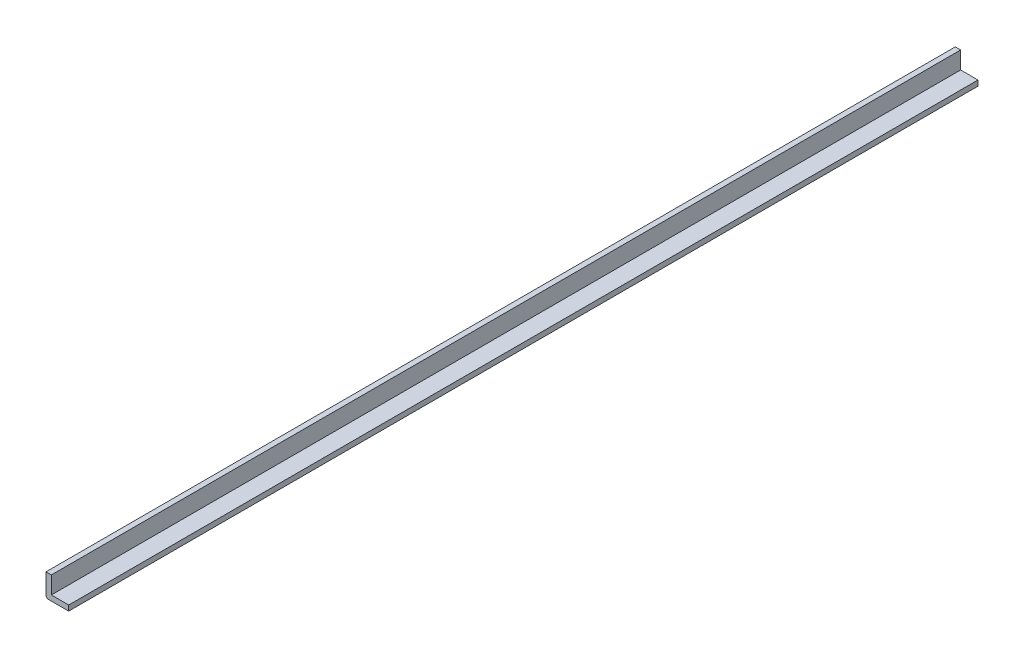
ISO-10303-21;
HEADER;
FILE_DESCRIPTION(('STEP AP214'),'2;1');
FILE_NAME('part.step','',(''),(''),'','','');
FILE_SCHEMA(('AUTOMOTIVE_DESIGN { 1 0 10303 214 1 1 1 1 }'));
ENDSEC;
DATA;
#1=APPLICATION_CONTEXT('core data for automotive mechanical design processes');
#2=APPLICATION_PROTOCOL_DEFINITION('international standard','automotive_design',2000,#1);
#3=PRODUCT_CONTEXT('',#1,'mechanical');
#4=PRODUCT('Part','Part','',(#3));
#5=PRODUCT_RELATED_PRODUCT_CATEGORY('part','',(#4));
#6=PRODUCT_DEFINITION_FORMATION('','',#4);
#7=PRODUCT_DEFINITION_CONTEXT('part definition',#1,'design');
#8=PRODUCT_DEFINITION('design','',#6,#7);
#9=PRODUCT_DEFINITION_SHAPE('','',#8);
#10=(LENGTH_UNIT() NAMED_UNIT(*) SI_UNIT(.MILLI.,.METRE.));
#11=(NAMED_UNIT(*) PLANE_ANGLE_UNIT() SI_UNIT($,.RADIAN.));
#12=(NAMED_UNIT(*) SI_UNIT($,.STERADIAN.) SOLID_ANGLE_UNIT());
#13=UNCERTAINTY_MEASURE_WITH_UNIT(LENGTH_MEASURE(1.E-05),#10,'distance_accuracy_value','');
#14=(GEOMETRIC_REPRESENTATION_CONTEXT(3) GLOBAL_UNCERTAINTY_ASSIGNED_CONTEXT((#13)) GLOBAL_UNIT_ASSIGNED_CONTEXT((#10,
#11,#12)) REPRESENTATION_CONTEXT('',''));
#15=CARTESIAN_POINT('',(0.,0.,0.));
#16=DIRECTION('',(0.,0.,1.));
#17=DIRECTION('',(1.,0.,0.));
#18=AXIS2_PLACEMENT_3D('',#15,#16,#17);
#19=CARTESIAN_POINT('',(0.,2.,340.5));
#20=DIRECTION('',(-1.,0.,0.));
#21=DIRECTION('',(0.,-1.,0.));
#22=AXIS2_PLACEMENT_3D('',#19,#20,#21);
#23=PLANE('',#22);
#24=DIRECTION('',(0.,1.,0.));
#25=VECTOR('',#24,1.);
#26=CARTESIAN_POINT('',(0.,2.,0.));
#27=LINE('',#26,#25);
#28=CARTESIAN_POINT('',(0.,0.,0.));
#29=VERTEX_POINT('',#28);
#30=CARTESIAN_POINT('',(0.,2.,0.));
#31=VERTEX_POINT('',#30);
#32=EDGE_CURVE('E123',#29,#31,#27,.T.);
#33=ORIENTED_EDGE('',*,*,#32,.T.);
#34=DIRECTION('',(0.,0.,-1.));
#35=VECTOR('',#34,1.);
#36=CARTESIAN_POINT('',(0.,2.,340.5));
#37=LINE('',#36,#35);
#38=CARTESIAN_POINT('',(0.,2.,340.5));
#39=VERTEX_POINT('',#38);
#40=EDGE_CURVE('E104',#39,#31,#37,.T.);
#41=ORIENTED_EDGE('',*,*,#40,.F.);
#42=DIRECTION('',(0.,1.,0.));
#43=VECTOR('',#42,1.);
#44=CARTESIAN_POINT('',(0.,2.,340.5));
#45=LINE('',#44,#43);
#46=CARTESIAN_POINT('',(0.,0.,340.5));
#47=VERTEX_POINT('',#46);
#48=EDGE_CURVE('E111',#47,#39,#45,.T.);
#49=ORIENTED_EDGE('',*,*,#48,.F.);
#50=DIRECTION('',(0.,0.,-1.));
#51=VECTOR('',#50,1.);
#52=CARTESIAN_POINT('',(0.,0.,340.5));
#53=LINE('',#52,#51);
#54=EDGE_CURVE('E137',#47,#29,#53,.T.);
#55=ORIENTED_EDGE('',*,*,#54,.T.);
#56=EDGE_LOOP('',(#33,#41,#49,#55));
#57=FACE_BOUND('',#56,.T.);
#58=ADVANCED_FACE('F41',(#57),#23,.F.);
#59=CARTESIAN_POINT('',(-6.5,2.,340.5));
#60=DIRECTION('',(0.,-1.,0.));
#61=DIRECTION('',(0.,0.,-1.));
#62=AXIS2_PLACEMENT_3D('',#59,#60,#61);
#63=PLANE('',#62);
#64=DIRECTION('',(-1.,0.,0.));
#65=VECTOR('',#64,1.);
#66=CARTESIAN_POINT('',(-6.5,2.,0.));
#67=LINE('',#66,#65);
#68=CARTESIAN_POINT('',(-6.5,2.,0.));
#69=VERTEX_POINT('',#68);
#70=EDGE_CURVE('E146',#31,#69,#67,.T.);
#71=ORIENTED_EDGE('',*,*,#70,.T.);
#72=DIRECTION('',(0.,0.,-1.));
#73=VECTOR('',#72,1.);
#74=CARTESIAN_POINT('',(-6.5,2.,340.5));
#75=LINE('',#74,#73);
#76=CARTESIAN_POINT('',(-6.5,2.,340.5));
#77=VERTEX_POINT('',#76);
#78=EDGE_CURVE('E107',#77,#69,#75,.T.);
#79=ORIENTED_EDGE('',*,*,#78,.F.);
#80=DIRECTION('',(-1.,0.,0.));
#81=VECTOR('',#80,1.);
#82=CARTESIAN_POINT('',(-6.5,2.,340.5));
#83=LINE('',#82,#81);
#84=EDGE_CURVE('E100',#39,#77,#83,.T.);
#85=ORIENTED_EDGE('',*,*,#84,.F.);
#86=ORIENTED_EDGE('',*,*,#40,.T.);
#87=EDGE_LOOP('',(#71,#79,#85,#86));
#88=FACE_BOUND('',#87,.T.);
#89=ADVANCED_FACE('F102',(#88),#63,.F.);
#90=CARTESIAN_POINT('',(-6.5,8.5,340.5));
#91=DIRECTION('',(-1.,0.,0.));
#92=DIRECTION('',(0.,0.,1.));
#93=AXIS2_PLACEMENT_3D('',#90,#91,#92);
#94=PLANE('',#93);
#95=DIRECTION('',(0.,1.,0.));
#96=VECTOR('',#95,1.);
#97=CARTESIAN_POINT('',(-6.5,8.5,0.));
#98=LINE('',#97,#96);
#99=CARTESIAN_POINT('',(-6.5,8.5,0.));
#100=VERTEX_POINT('',#99);
#101=EDGE_CURVE('E144',#69,#100,#98,.T.);
#102=ORIENTED_EDGE('',*,*,#101,.T.);
#103=DIRECTION('',(0.,0.,-1.));
#104=VECTOR('',#103,1.);
#105=CARTESIAN_POINT('',(-6.5,8.5,340.5));
#106=LINE('',#105,#104);
#107=CARTESIAN_POINT('',(-6.5,8.5,340.5));
#108=VERTEX_POINT('',#107);
#109=EDGE_CURVE('E128',#108,#100,#106,.T.);
#110=ORIENTED_EDGE('',*,*,#109,.F.);
#111=DIRECTION('',(0.,1.,0.));
#112=VECTOR('',#111,1.);
#113=CARTESIAN_POINT('',(-6.5,8.5,340.5));
#114=LINE('',#113,#112);
#115=EDGE_CURVE('E110',#77,#108,#114,.T.);
#116=ORIENTED_EDGE('',*,*,#115,.F.);
#117=ORIENTED_EDGE('',*,*,#78,.T.);
#118=EDGE_LOOP('',(#102,#110,#116,#117));
#119=FACE_BOUND('',#118,.T.);
#120=ADVANCED_FACE('F158',(#119),#94,.F.);
#121=CARTESIAN_POINT('',(-8.5,8.5,340.5));
#122=DIRECTION('',(0.,-1.,0.));
#123=DIRECTION('',(0.,0.,-1.));
#124=AXIS2_PLACEMENT_3D('',#121,#122,#123);
#125=PLANE('',#124);
#126=DIRECTION('',(-1.,0.,0.));
#127=VECTOR('',#126,1.);
#128=CARTESIAN_POINT('',(-8.5,8.5,0.));
#129=LINE('',#128,#127);
#130=CARTESIAN_POINT('',(-8.5,8.5,0.));
#131=VERTEX_POINT('',#130);
#132=EDGE_CURVE('E142',#100,#131,#129,.T.);
#133=ORIENTED_EDGE('',*,*,#132,.T.);
#134=DIRECTION('',(0.,0.,-1.));
#135=VECTOR('',#134,1.);
#136=CARTESIAN_POINT('',(-8.5,8.5,340.5));
#137=LINE('',#136,#135);
#138=CARTESIAN_POINT('',(-8.5,8.5,340.5));
#139=VERTEX_POINT('',#138);
#140=EDGE_CURVE('E134',#139,#131,#137,.T.);
#141=ORIENTED_EDGE('',*,*,#140,.F.);
#142=DIRECTION('',(-1.,0.,0.));
#143=VECTOR('',#142,1.);
#144=CARTESIAN_POINT('',(-8.5,8.5,340.5));
#145=LINE('',#144,#143);
#146=EDGE_CURVE('E152',#108,#139,#145,.T.);
#147=ORIENTED_EDGE('',*,*,#146,.F.);
#148=ORIENTED_EDGE('',*,*,#109,.T.);
#149=EDGE_LOOP('',(#133,#141,#147,#148));
#150=FACE_BOUND('',#149,.T.);
#151=ADVANCED_FACE('F162',(#150),#125,.F.);
#152=CARTESIAN_POINT('',(-8.5,0.,340.5));
#153=DIRECTION('',(1.,0.,0.));
#154=DIRECTION('',(0.,0.,-1.));
#155=AXIS2_PLACEMENT_3D('',#152,#153,#154);
#156=PLANE('',#155);
#157=DIRECTION('',(0.,-1.,0.));
#158=VECTOR('',#157,1.);
#159=CARTESIAN_POINT('',(-8.5,0.,0.));
#160=LINE('',#159,#158);
#161=CARTESIAN_POINT('',(-8.5,0.999999999999999,0.));
#162=VERTEX_POINT('',#161);
#163=EDGE_CURVE('E140',#131,#162,#160,.T.);
#164=ORIENTED_EDGE('',*,*,#163,.T.);
#165=DIRECTION('',(0.,0.,-1.));
#166=VECTOR('',#165,1.);
#167=CARTESIAN_POINT('',(-8.5,0.999999999999999,340.5));
#168=LINE('',#167,#166);
#169=CARTESIAN_POINT('',(-8.5,0.999999999999999,340.5));
#170=VERTEX_POINT('',#169);
#171=EDGE_CURVE('E49',#162,#170,#168,.F.);
#172=ORIENTED_EDGE('',*,*,#171,.T.);
#173=DIRECTION('',(0.,-1.,0.));
#174=VECTOR('',#173,1.);
#175=CARTESIAN_POINT('',(-8.5,0.,340.5));
#176=LINE('',#175,#174);
#177=EDGE_CURVE('E150',#139,#170,#176,.T.);
#178=ORIENTED_EDGE('',*,*,#177,.F.);
#179=ORIENTED_EDGE('',*,*,#140,.T.);
#180=EDGE_LOOP('',(#164,#172,#178,#179));
#181=FACE_BOUND('',#180,.T.);
#182=ADVANCED_FACE('F163',(#181),#156,.F.);
#183=CARTESIAN_POINT('',(0.,0.,340.5));
#184=DIRECTION('',(0.,1.,0.));
#185=DIRECTION('',(-1.,0.,0.));
#186=AXIS2_PLACEMENT_3D('',#183,#184,#185);
#187=PLANE('',#186);
#188=DIRECTION('',(1.,0.,0.));
#189=VECTOR('',#188,1.);
#190=CARTESIAN_POINT('',(0.,0.,340.5));
#191=LINE('',#190,#189);
#192=CARTESIAN_POINT('',(-7.5,0.,340.5));
#193=VERTEX_POINT('',#192);
#194=EDGE_CURVE('E116',#193,#47,#191,.T.);
#195=ORIENTED_EDGE('',*,*,#194,.F.);
#196=DIRECTION('',(0.,0.,-1.));
#197=VECTOR('',#196,1.);
#198=CARTESIAN_POINT('',(-7.5,0.,340.5));
#199=LINE('',#198,#197);
#200=CARTESIAN_POINT('',(-7.5,0.,0.));
#201=VERTEX_POINT('',#200);
#202=EDGE_CURVE('E124',#193,#201,#199,.T.);
#203=ORIENTED_EDGE('',*,*,#202,.T.);
#204=DIRECTION('',(1.,0.,0.));
#205=VECTOR('',#204,1.);
#206=CARTESIAN_POINT('',(0.,0.,0.));
#207=LINE('',#206,#205);
#208=EDGE_CURVE('E120',#201,#29,#207,.T.);
#209=ORIENTED_EDGE('',*,*,#208,.T.);
#210=ORIENTED_EDGE('',*,*,#54,.F.);
#211=EDGE_LOOP('',(#195,#203,#209,#210));
#212=FACE_BOUND('',#211,.T.);
#213=ADVANCED_FACE('F168',(#212),#187,.F.);
#214=CARTESIAN_POINT('',(0.,0.,340.5));
#215=DIRECTION('',(0.,0.,-1.));
#216=DIRECTION('',(-1.,0.,0.));
#217=AXIS2_PLACEMENT_3D('',#214,#215,#216);
#218=PLANE('',#217);
#219=ORIENTED_EDGE('',*,*,#177,.T.);
#220=CARTESIAN_POINT('',(-7.5,0.999999999999999,340.5));
#221=DIRECTION('',(0.,0.,-1.));
#222=DIRECTION('',(-1.,0.,0.));
#223=AXIS2_PLACEMENT_3D('',#220,#221,#222);
#224=CIRCLE('',#223,1.);
#225=EDGE_CURVE('E11',#170,#193,#224,.F.);
#226=ORIENTED_EDGE('',*,*,#225,.T.);
#227=ORIENTED_EDGE('',*,*,#194,.T.);
#228=ORIENTED_EDGE('',*,*,#48,.T.);
#229=ORIENTED_EDGE('',*,*,#84,.T.);
#230=ORIENTED_EDGE('',*,*,#115,.T.);
#231=ORIENTED_EDGE('',*,*,#146,.T.);
#232=EDGE_LOOP('',(#219,#226,#227,#228,#229,#230,#231));
#233=FACE_BOUND('',#232,.T.);
#234=ADVANCED_FACE('F114',(#233),#218,.F.);
#235=CARTESIAN_POINT('',(0.,0.,0.));
#236=DIRECTION('',(0.,0.,-1.));
#237=DIRECTION('',(-1.,0.,0.));
#238=AXIS2_PLACEMENT_3D('',#235,#236,#237);
#239=PLANE('',#238);
#240=ORIENTED_EDGE('',*,*,#208,.F.);
#241=CARTESIAN_POINT('',(-7.5,0.999999999999999,0.));
#242=DIRECTION('',(0.,0.,-1.));
#243=DIRECTION('',(-1.,0.,0.));
#244=AXIS2_PLACEMENT_3D('',#241,#242,#243);
#245=CIRCLE('',#244,1.);
#246=EDGE_CURVE('E63',#201,#162,#245,.T.);
#247=ORIENTED_EDGE('',*,*,#246,.T.);
#248=ORIENTED_EDGE('',*,*,#163,.F.);
#249=ORIENTED_EDGE('',*,*,#132,.F.);
#250=ORIENTED_EDGE('',*,*,#101,.F.);
#251=ORIENTED_EDGE('',*,*,#70,.F.);
#252=ORIENTED_EDGE('',*,*,#32,.F.);
#253=EDGE_LOOP('',(#240,#247,#248,#249,#250,#251,#252));
#254=FACE_BOUND('',#253,.T.);
#255=ADVANCED_FACE('F169',(#254),#239,.T.);
#256=CARTESIAN_POINT('',(-7.5,0.999999999999999,340.5));
#257=DIRECTION('',(0.,0.,-1.));
#258=DIRECTION('',(-1.,0.,0.));
#259=AXIS2_PLACEMENT_3D('',#256,#257,#258);
#260=CYLINDRICAL_SURFACE('',#259,1.);
#261=ORIENTED_EDGE('',*,*,#225,.F.);
#262=ORIENTED_EDGE('',*,*,#171,.F.);
#263=ORIENTED_EDGE('',*,*,#246,.F.);
#264=ORIENTED_EDGE('',*,*,#202,.F.);
#265=EDGE_LOOP('',(#261,#262,#263,#264));
#266=FACE_BOUND('',#265,.T.);
#267=ADVANCED_FACE('F43',(#266),#260,.T.);
#268=CLOSED_SHELL('',(#58,#89,#120,#151,#182,#213,#234,#255,#267));
#269=MANIFOLD_SOLID_BREP('B2',#268);
#270=ADVANCED_BREP_SHAPE_REPRESENTATION('',(#18,#269),#14);
#271=SHAPE_DEFINITION_REPRESENTATION(#9,#270);
ENDSEC;
END-ISO-10303-21;
